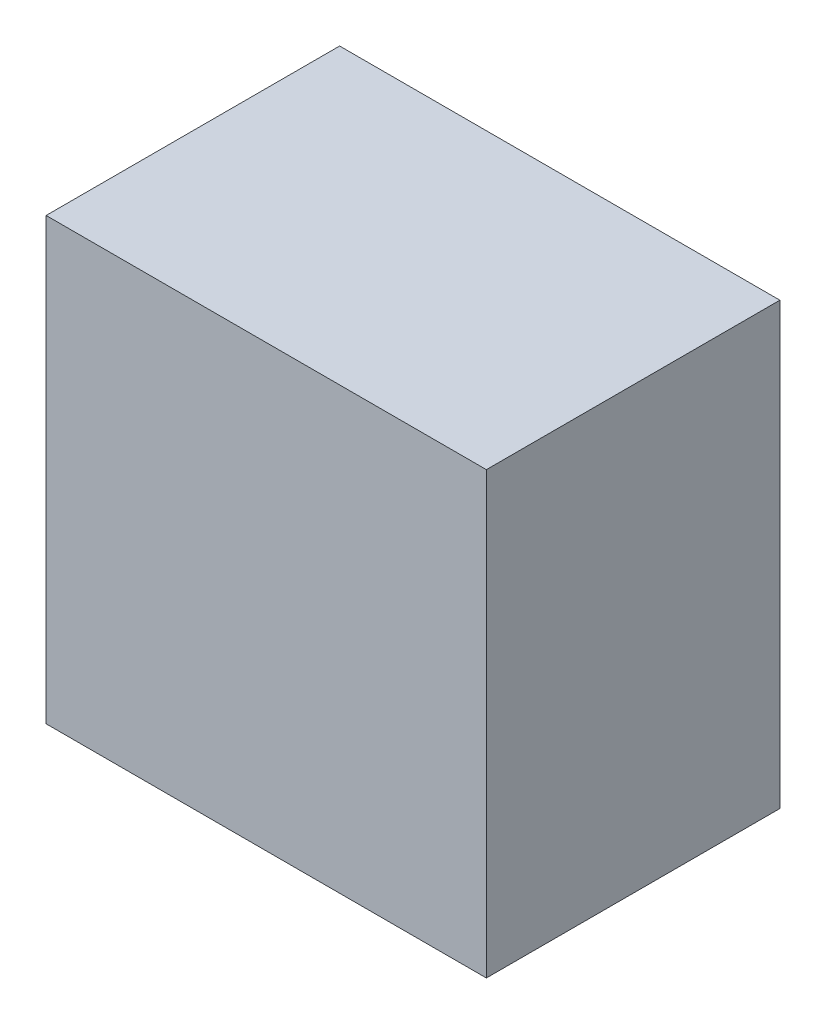
ISO-10303-21;
HEADER;
FILE_DESCRIPTION(('STEP AP214'),'2;1');
FILE_NAME('part.step','',(''),(''),'','','');
FILE_SCHEMA(('AUTOMOTIVE_DESIGN { 1 0 10303 214 1 1 1 1 }'));
ENDSEC;
DATA;
#1=APPLICATION_CONTEXT('core data for automotive mechanical design processes');
#2=APPLICATION_PROTOCOL_DEFINITION('international standard','automotive_design',2000,#1);
#3=PRODUCT_CONTEXT('',#1,'mechanical');
#4=PRODUCT('Part','Part','',(#3));
#5=PRODUCT_RELATED_PRODUCT_CATEGORY('part','',(#4));
#6=PRODUCT_DEFINITION_FORMATION('','',#4);
#7=PRODUCT_DEFINITION_CONTEXT('part definition',#1,'design');
#8=PRODUCT_DEFINITION('design','',#6,#7);
#9=PRODUCT_DEFINITION_SHAPE('','',#8);
#10=(LENGTH_UNIT() NAMED_UNIT(*) SI_UNIT(.MILLI.,.METRE.));
#11=(NAMED_UNIT(*) PLANE_ANGLE_UNIT() SI_UNIT($,.RADIAN.));
#12=(NAMED_UNIT(*) SI_UNIT($,.STERADIAN.) SOLID_ANGLE_UNIT());
#13=UNCERTAINTY_MEASURE_WITH_UNIT(LENGTH_MEASURE(1.E-05),#10,'distance_accuracy_value','');
#14=(GEOMETRIC_REPRESENTATION_CONTEXT(3) GLOBAL_UNCERTAINTY_ASSIGNED_CONTEXT((#13)) GLOBAL_UNIT_ASSIGNED_CONTEXT((#10,
#11,#12)) REPRESENTATION_CONTEXT('',''));
#15=CARTESIAN_POINT('',(0.,0.,0.));
#16=DIRECTION('',(0.,0.,1.));
#17=DIRECTION('',(1.,0.,0.));
#18=AXIS2_PLACEMENT_3D('',#15,#16,#17);
#19=CARTESIAN_POINT('',(0.,0.,25.4));
#20=DIRECTION('',(1.,0.,0.));
#21=DIRECTION('',(0.,0.,-1.));
#22=AXIS2_PLACEMENT_3D('',#19,#20,#21);
#23=PLANE('',#22);
#24=DIRECTION('',(0.,-1.,0.));
#25=VECTOR('',#24,1.);
#26=CARTESIAN_POINT('',(0.,0.,0.));
#27=LINE('',#26,#25);
#28=CARTESIAN_POINT('',(0.,0.,0.));
#29=VERTEX_POINT('',#28);
#30=CARTESIAN_POINT('',(0.,-38.1,0.));
#31=VERTEX_POINT('',#30);
#32=EDGE_CURVE('E107',#29,#31,#27,.T.);
#33=ORIENTED_EDGE('',*,*,#32,.T.);
#34=DIRECTION('',(0.,0.,-1.));
#35=VECTOR('',#34,1.);
#36=CARTESIAN_POINT('',(0.,-38.1,25.4));
#37=LINE('',#36,#35);
#38=CARTESIAN_POINT('',(0.,-38.1,25.4));
#39=VERTEX_POINT('',#38);
#40=EDGE_CURVE('E11',#39,#31,#37,.T.);
#41=ORIENTED_EDGE('',*,*,#40,.F.);
#42=DIRECTION('',(0.,-1.,0.));
#43=VECTOR('',#42,1.);
#44=CARTESIAN_POINT('',(0.,0.,25.4));
#45=LINE('',#44,#43);
#46=CARTESIAN_POINT('',(0.,0.,25.4));
#47=VERTEX_POINT('',#46);
#48=EDGE_CURVE('E91',#47,#39,#45,.T.);
#49=ORIENTED_EDGE('',*,*,#48,.F.);
#50=DIRECTION('',(0.,0.,-1.));
#51=VECTOR('',#50,1.);
#52=CARTESIAN_POINT('',(0.,0.,25.4));
#53=LINE('',#52,#51);
#54=EDGE_CURVE('E103',#47,#29,#53,.T.);
#55=ORIENTED_EDGE('',*,*,#54,.T.);
#56=EDGE_LOOP('',(#33,#41,#49,#55));
#57=FACE_BOUND('',#56,.T.);
#58=ADVANCED_FACE('F39',(#57),#23,.F.);
#59=CARTESIAN_POINT('',(0.,-38.1,25.4));
#60=DIRECTION('',(0.,1.,0.));
#61=DIRECTION('',(0.,0.,1.));
#62=AXIS2_PLACEMENT_3D('',#59,#60,#61);
#63=PLANE('',#62);
#64=DIRECTION('',(1.,0.,0.));
#65=VECTOR('',#64,1.);
#66=CARTESIAN_POINT('',(0.,-38.1,0.));
#67=LINE('',#66,#65);
#68=CARTESIAN_POINT('',(38.1,-38.1,0.));
#69=VERTEX_POINT('',#68);
#70=EDGE_CURVE('E96',#31,#69,#67,.T.);
#71=ORIENTED_EDGE('',*,*,#70,.T.);
#72=DIRECTION('',(0.,0.,-1.));
#73=VECTOR('',#72,1.);
#74=CARTESIAN_POINT('',(38.1,-38.1,25.4));
#75=LINE('',#74,#73);
#76=CARTESIAN_POINT('',(38.1,-38.1,25.4));
#77=VERTEX_POINT('',#76);
#78=EDGE_CURVE('E48',#77,#69,#75,.T.);
#79=ORIENTED_EDGE('',*,*,#78,.F.);
#80=DIRECTION('',(1.,0.,0.));
#81=VECTOR('',#80,1.);
#82=CARTESIAN_POINT('',(0.,-38.1,25.4));
#83=LINE('',#82,#81);
#84=EDGE_CURVE('E86',#39,#77,#83,.T.);
#85=ORIENTED_EDGE('',*,*,#84,.F.);
#86=ORIENTED_EDGE('',*,*,#40,.T.);
#87=EDGE_LOOP('',(#71,#79,#85,#86));
#88=FACE_BOUND('',#87,.T.);
#89=ADVANCED_FACE('F95',(#88),#63,.F.);
#90=CARTESIAN_POINT('',(38.1,0.,25.4));
#91=DIRECTION('',(-1.,0.,0.));
#92=DIRECTION('',(0.,-1.,0.));
#93=AXIS2_PLACEMENT_3D('',#90,#91,#92);
#94=PLANE('',#93);
#95=DIRECTION('',(0.,1.,0.));
#96=VECTOR('',#95,1.);
#97=CARTESIAN_POINT('',(38.1,0.,0.));
#98=LINE('',#97,#96);
#99=CARTESIAN_POINT('',(38.1,0.,0.));
#100=VERTEX_POINT('',#99);
#101=EDGE_CURVE('E73',#69,#100,#98,.T.);
#102=ORIENTED_EDGE('',*,*,#101,.T.);
#103=DIRECTION('',(0.,0.,-1.));
#104=VECTOR('',#103,1.);
#105=CARTESIAN_POINT('',(38.1,0.,25.4));
#106=LINE('',#105,#104);
#107=CARTESIAN_POINT('',(38.1,0.,25.4));
#108=VERTEX_POINT('',#107);
#109=EDGE_CURVE('E98',#108,#100,#106,.T.);
#110=ORIENTED_EDGE('',*,*,#109,.F.);
#111=DIRECTION('',(0.,1.,0.));
#112=VECTOR('',#111,1.);
#113=CARTESIAN_POINT('',(38.1,0.,25.4));
#114=LINE('',#113,#112);
#115=EDGE_CURVE('E89',#77,#108,#114,.T.);
#116=ORIENTED_EDGE('',*,*,#115,.F.);
#117=ORIENTED_EDGE('',*,*,#78,.T.);
#118=EDGE_LOOP('',(#102,#110,#116,#117));
#119=FACE_BOUND('',#118,.T.);
#120=ADVANCED_FACE('F99',(#119),#94,.F.);
#121=CARTESIAN_POINT('',(0.,0.,25.4));
#122=DIRECTION('',(0.,-1.,0.));
#123=DIRECTION('',(0.,0.,-1.));
#124=AXIS2_PLACEMENT_3D('',#121,#122,#123);
#125=PLANE('',#124);
#126=DIRECTION('',(-1.,0.,0.));
#127=VECTOR('',#126,1.);
#128=CARTESIAN_POINT('',(0.,0.,0.));
#129=LINE('',#128,#127);
#130=EDGE_CURVE('E79',#100,#29,#129,.T.);
#131=ORIENTED_EDGE('',*,*,#130,.T.);
#132=ORIENTED_EDGE('',*,*,#54,.F.);
#133=DIRECTION('',(-1.,0.,0.));
#134=VECTOR('',#133,1.);
#135=CARTESIAN_POINT('',(0.,0.,25.4));
#136=LINE('',#135,#134);
#137=EDGE_CURVE('E56',#108,#47,#136,.T.);
#138=ORIENTED_EDGE('',*,*,#137,.F.);
#139=ORIENTED_EDGE('',*,*,#109,.T.);
#140=EDGE_LOOP('',(#131,#132,#138,#139));
#141=FACE_BOUND('',#140,.T.);
#142=ADVANCED_FACE('F120',(#141),#125,.F.);
#143=CARTESIAN_POINT('',(0.,0.,25.4));
#144=DIRECTION('',(0.,0.,1.));
#145=DIRECTION('',(1.,0.,0.));
#146=AXIS2_PLACEMENT_3D('',#143,#144,#145);
#147=PLANE('',#146);
#148=ORIENTED_EDGE('',*,*,#48,.T.);
#149=ORIENTED_EDGE('',*,*,#84,.T.);
#150=ORIENTED_EDGE('',*,*,#115,.T.);
#151=ORIENTED_EDGE('',*,*,#137,.T.);
#152=EDGE_LOOP('',(#148,#149,#150,#151));
#153=FACE_BOUND('',#152,.T.);
#154=ADVANCED_FACE('F87',(#153),#147,.T.);
#155=CARTESIAN_POINT('',(0.,0.,0.));
#156=DIRECTION('',(0.,0.,1.));
#157=DIRECTION('',(1.,0.,0.));
#158=AXIS2_PLACEMENT_3D('',#155,#156,#157);
#159=PLANE('',#158);
#160=ORIENTED_EDGE('',*,*,#32,.F.);
#161=ORIENTED_EDGE('',*,*,#130,.F.);
#162=ORIENTED_EDGE('',*,*,#101,.F.);
#163=ORIENTED_EDGE('',*,*,#70,.F.);
#164=EDGE_LOOP('',(#160,#161,#162,#163));
#165=FACE_BOUND('',#164,.T.);
#166=ADVANCED_FACE('F123',(#165),#159,.F.);
#167=CLOSED_SHELL('',(#58,#89,#120,#142,#154,#166));
#168=MANIFOLD_SOLID_BREP('B2',#167);
#169=ADVANCED_BREP_SHAPE_REPRESENTATION('',(#18,#168),#14);
#170=SHAPE_DEFINITION_REPRESENTATION(#9,#169);
ENDSEC;
END-ISO-10303-21;
